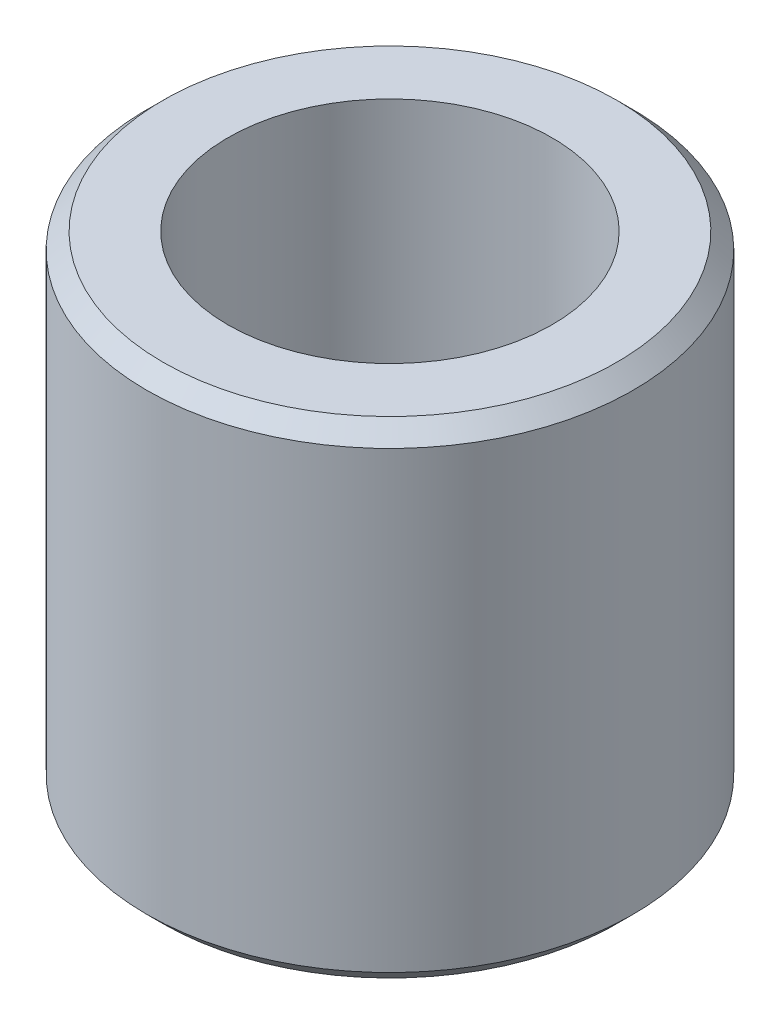
ISO-10303-21;
HEADER;
FILE_DESCRIPTION(('STEP AP214'),'2;1');
FILE_NAME('part.step','',(''),(''),'','','');
FILE_SCHEMA(('AUTOMOTIVE_DESIGN { 1 0 10303 214 1 1 1 1 }'));
ENDSEC;
DATA;
#1=APPLICATION_CONTEXT('core data for automotive mechanical design processes');
#2=APPLICATION_PROTOCOL_DEFINITION('international standard','automotive_design',2000,#1);
#3=PRODUCT_CONTEXT('',#1,'mechanical');
#4=PRODUCT('Part','Part','',(#3));
#5=PRODUCT_RELATED_PRODUCT_CATEGORY('part','',(#4));
#6=PRODUCT_DEFINITION_FORMATION('','',#4);
#7=PRODUCT_DEFINITION_CONTEXT('part definition',#1,'design');
#8=PRODUCT_DEFINITION('design','',#6,#7);
#9=PRODUCT_DEFINITION_SHAPE('','',#8);
#10=(LENGTH_UNIT() NAMED_UNIT(*) SI_UNIT(.MILLI.,.METRE.));
#11=(NAMED_UNIT(*) PLANE_ANGLE_UNIT() SI_UNIT($,.RADIAN.));
#12=(NAMED_UNIT(*) SI_UNIT($,.STERADIAN.) SOLID_ANGLE_UNIT());
#13=UNCERTAINTY_MEASURE_WITH_UNIT(LENGTH_MEASURE(1.E-05),#10,'distance_accuracy_value','');
#14=(GEOMETRIC_REPRESENTATION_CONTEXT(3) GLOBAL_UNCERTAINTY_ASSIGNED_CONTEXT((#13)) GLOBAL_UNIT_ASSIGNED_CONTEXT((#10,
#11,#12)) REPRESENTATION_CONTEXT('',''));
#15=CARTESIAN_POINT('',(0.,0.,0.));
#16=DIRECTION('',(0.,0.,1.));
#17=DIRECTION('',(1.,0.,0.));
#18=AXIS2_PLACEMENT_3D('',#15,#16,#17);
#19=CARTESIAN_POINT('',(0.,15.,0.));
#20=DIRECTION('',(0.,1.,0.));
#21=DIRECTION('',(0.,0.,1.));
#22=AXIS2_PLACEMENT_3D('',#19,#20,#21);
#23=PLANE('',#22);
#24=CARTESIAN_POINT('',(0.,15.,0.));
#25=DIRECTION('',(0.,1.,0.));
#26=DIRECTION('',(0.,0.,1.));
#27=AXIS2_PLACEMENT_3D('',#24,#25,#26);
#28=CIRCLE('',#27,14.);
#29=CARTESIAN_POINT('',(0.,15.,14.));
#30=VERTEX_POINT('',#29);
#31=EDGE_CURVE('E10',#30,#30,#28,.T.);
#32=ORIENTED_EDGE('',*,*,#31,.T.);
#33=EDGE_LOOP('',(#32));
#34=FACE_BOUND('',#33,.T.);
#35=CARTESIAN_POINT('',(0.,15.,0.));
#36=DIRECTION('',(0.,1.,0.));
#37=DIRECTION('',(0.,0.,1.));
#38=AXIS2_PLACEMENT_3D('',#35,#36,#37);
#39=CIRCLE('',#38,10.);
#40=CARTESIAN_POINT('',(0.,15.,10.));
#41=VERTEX_POINT('',#40);
#42=EDGE_CURVE('E54',#41,#41,#39,.T.);
#43=ORIENTED_EDGE('',*,*,#42,.F.);
#44=EDGE_LOOP('',(#43));
#45=FACE_BOUND('',#44,.T.);
#46=ADVANCED_FACE('F34',(#34,#45),#23,.T.);
#47=CARTESIAN_POINT('',(0.,-15.,0.));
#48=DIRECTION('',(0.,1.,0.));
#49=DIRECTION('',(0.,0.,1.));
#50=AXIS2_PLACEMENT_3D('',#47,#48,#49);
#51=PLANE('',#50);
#52=CARTESIAN_POINT('',(0.,-15.,0.));
#53=DIRECTION('',(0.,1.,0.));
#54=DIRECTION('',(0.,0.,1.));
#55=AXIS2_PLACEMENT_3D('',#52,#53,#54);
#56=CIRCLE('',#55,14.);
#57=CARTESIAN_POINT('',(0.,-15.,14.));
#58=VERTEX_POINT('',#57);
#59=EDGE_CURVE('E41',#58,#58,#56,.F.);
#60=ORIENTED_EDGE('',*,*,#59,.T.);
#61=EDGE_LOOP('',(#60));
#62=FACE_BOUND('',#61,.T.);
#63=CARTESIAN_POINT('',(0.,-15.,0.));
#64=DIRECTION('',(0.,1.,0.));
#65=DIRECTION('',(0.,0.,1.));
#66=AXIS2_PLACEMENT_3D('',#63,#64,#65);
#67=CIRCLE('',#66,10.);
#68=CARTESIAN_POINT('',(0.,-15.,10.));
#69=VERTEX_POINT('',#68);
#70=EDGE_CURVE('E55',#69,#69,#67,.T.);
#71=ORIENTED_EDGE('',*,*,#70,.T.);
#72=EDGE_LOOP('',(#71));
#73=FACE_BOUND('',#72,.T.);
#74=ADVANCED_FACE('F65',(#62,#73),#51,.F.);
#75=CARTESIAN_POINT('',(0.,15.,0.));
#76=DIRECTION('',(0.,-1.,0.));
#77=DIRECTION('',(0.,0.,-1.));
#78=AXIS2_PLACEMENT_3D('',#75,#76,#77);
#79=CYLINDRICAL_SURFACE('',#78,15.);
#80=CARTESIAN_POINT('',(0.,-14.,0.));
#81=DIRECTION('',(0.,1.,0.));
#82=DIRECTION('',(0.,0.,1.));
#83=AXIS2_PLACEMENT_3D('',#80,#81,#82);
#84=CIRCLE('',#83,15.);
#85=CARTESIAN_POINT('',(0.,-14.,15.));
#86=VERTEX_POINT('',#85);
#87=EDGE_CURVE('E45',#86,#86,#84,.T.);
#88=ORIENTED_EDGE('',*,*,#87,.T.);
#89=EDGE_LOOP('',(#88));
#90=FACE_BOUND('',#89,.T.);
#91=CARTESIAN_POINT('',(0.,14.,0.));
#92=DIRECTION('',(0.,1.,0.));
#93=DIRECTION('',(0.,0.,1.));
#94=AXIS2_PLACEMENT_3D('',#91,#92,#93);
#95=CIRCLE('',#94,15.);
#96=CARTESIAN_POINT('',(0.,14.,15.));
#97=VERTEX_POINT('',#96);
#98=EDGE_CURVE('E49',#97,#97,#95,.F.);
#99=ORIENTED_EDGE('',*,*,#98,.T.);
#100=EDGE_LOOP('',(#99));
#101=FACE_BOUND('',#100,.T.);
#102=ADVANCED_FACE('F70',(#90,#101),#79,.T.);
#103=CARTESIAN_POINT('',(0.,15.,0.));
#104=DIRECTION('',(0.,-1.,0.));
#105=DIRECTION('',(0.,0.,-1.));
#106=AXIS2_PLACEMENT_3D('',#103,#104,#105);
#107=CYLINDRICAL_SURFACE('',#106,10.);
#108=ORIENTED_EDGE('',*,*,#42,.T.);
#109=EDGE_LOOP('',(#108));
#110=FACE_BOUND('',#109,.T.);
#111=ORIENTED_EDGE('',*,*,#70,.F.);
#112=EDGE_LOOP('',(#111));
#113=FACE_BOUND('',#112,.T.);
#114=ADVANCED_FACE('F61',(#110,#113),#107,.F.);
#115=CARTESIAN_POINT('',(0.,-14.,0.));
#116=DIRECTION('',(0.,1.,0.));
#117=DIRECTION('',(0.,0.,1.));
#118=AXIS2_PLACEMENT_3D('',#115,#116,#117);
#119=CONICAL_SURFACE('',#118,15.,0.785398163397449);
#120=ORIENTED_EDGE('',*,*,#59,.F.);
#121=EDGE_LOOP('',(#120));
#122=FACE_BOUND('',#121,.T.);
#123=ORIENTED_EDGE('',*,*,#87,.F.);
#124=EDGE_LOOP('',(#123));
#125=FACE_BOUND('',#124,.T.);
#126=ADVANCED_FACE('F76',(#122,#125),#119,.T.);
#127=CARTESIAN_POINT('',(0.,15.,0.));
#128=DIRECTION('',(0.,-1.,0.));
#129=DIRECTION('',(0.,0.,-1.));
#130=AXIS2_PLACEMENT_3D('',#127,#128,#129);
#131=CONICAL_SURFACE('',#130,14.,0.785398163397447);
#132=ORIENTED_EDGE('',*,*,#98,.F.);
#133=EDGE_LOOP('',(#132));
#134=FACE_BOUND('',#133,.T.);
#135=ORIENTED_EDGE('',*,*,#31,.F.);
#136=EDGE_LOOP('',(#135));
#137=FACE_BOUND('',#136,.T.);
#138=ADVANCED_FACE('F36',(#134,#137),#131,.T.);
#139=CLOSED_SHELL('',(#46,#74,#102,#114,#126,#138));
#140=MANIFOLD_SOLID_BREP('B2',#139);
#141=ADVANCED_BREP_SHAPE_REPRESENTATION('',(#18,#140),#14);
#142=SHAPE_DEFINITION_REPRESENTATION(#9,#141);
ENDSEC;
END-ISO-10303-21;
